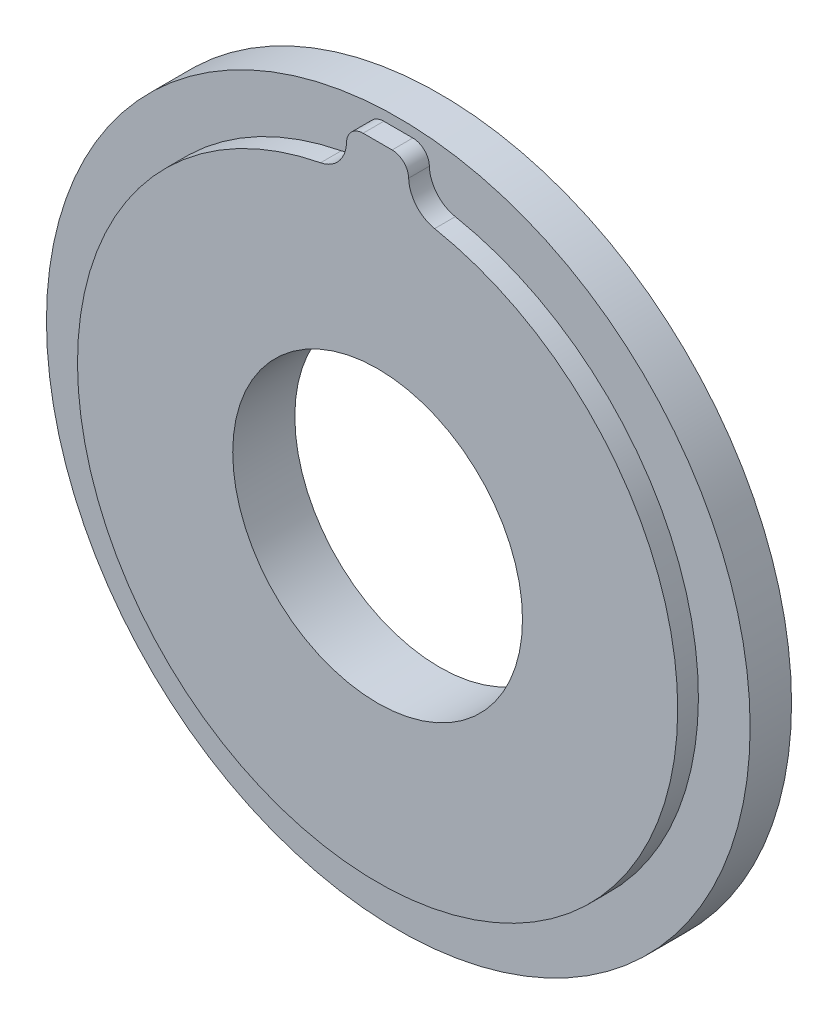
ISO-10303-21;
HEADER;
FILE_DESCRIPTION(('STEP AP214'),'2;1');
FILE_NAME('part.step','',(''),(''),'','','');
FILE_SCHEMA(('AUTOMOTIVE_DESIGN { 1 0 10303 214 1 1 1 1 }'));
ENDSEC;
DATA;
#1=APPLICATION_CONTEXT('core data for automotive mechanical design processes');
#2=APPLICATION_PROTOCOL_DEFINITION('international standard','automotive_design',2000,#1);
#3=PRODUCT_CONTEXT('',#1,'mechanical');
#4=PRODUCT('Part','Part','',(#3));
#5=PRODUCT_RELATED_PRODUCT_CATEGORY('part','',(#4));
#6=PRODUCT_DEFINITION_FORMATION('','',#4);
#7=PRODUCT_DEFINITION_CONTEXT('part definition',#1,'design');
#8=PRODUCT_DEFINITION('design','',#6,#7);
#9=PRODUCT_DEFINITION_SHAPE('','',#8);
#10=(LENGTH_UNIT() NAMED_UNIT(*) SI_UNIT(.MILLI.,.METRE.));
#11=(NAMED_UNIT(*) PLANE_ANGLE_UNIT() SI_UNIT($,.RADIAN.));
#12=(NAMED_UNIT(*) SI_UNIT($,.STERADIAN.) SOLID_ANGLE_UNIT());
#13=UNCERTAINTY_MEASURE_WITH_UNIT(LENGTH_MEASURE(1.E-05),#10,'distance_accuracy_value','');
#14=(GEOMETRIC_REPRESENTATION_CONTEXT(3) GLOBAL_UNCERTAINTY_ASSIGNED_CONTEXT((#13)) GLOBAL_UNIT_ASSIGNED_CONTEXT((#10,
#11,#12)) REPRESENTATION_CONTEXT('',''));
#15=CARTESIAN_POINT('',(0.,0.,0.));
#16=DIRECTION('',(0.,0.,1.));
#17=DIRECTION('',(1.,0.,0.));
#18=AXIS2_PLACEMENT_3D('',#15,#16,#17);
#19=CARTESIAN_POINT('',(0.,0.,2.));
#20=DIRECTION('',(0.,0.,-1.));
#21=DIRECTION('',(-1.,0.,0.));
#22=AXIS2_PLACEMENT_3D('',#19,#20,#21);
#23=CYLINDRICAL_SURFACE('',#22,17.);
#24=CARTESIAN_POINT('',(0.,0.,2.));
#25=DIRECTION('',(0.,0.,1.));
#26=DIRECTION('',(1.,0.,0.));
#27=AXIS2_PLACEMENT_3D('',#24,#25,#26);
#28=CIRCLE('',#27,17.);
#29=CARTESIAN_POINT('',(17.,0.,2.));
#30=VERTEX_POINT('',#29);
#31=EDGE_CURVE('E135',#30,#30,#28,.T.);
#32=ORIENTED_EDGE('',*,*,#31,.F.);
#33=EDGE_LOOP('',(#32));
#34=FACE_BOUND('',#33,.T.);
#35=CARTESIAN_POINT('',(0.,0.,0.));
#36=DIRECTION('',(0.,0.,1.));
#37=DIRECTION('',(1.,0.,0.));
#38=AXIS2_PLACEMENT_3D('',#35,#36,#37);
#39=CIRCLE('',#38,17.);
#40=CARTESIAN_POINT('',(17.,0.,0.));
#41=VERTEX_POINT('',#40);
#42=EDGE_CURVE('E139',#41,#41,#39,.T.);
#43=ORIENTED_EDGE('',*,*,#42,.T.);
#44=EDGE_LOOP('',(#43));
#45=FACE_BOUND('',#44,.T.);
#46=ADVANCED_FACE('F41',(#34,#45),#23,.T.);
#47=CARTESIAN_POINT('',(0.,0.,2.));
#48=DIRECTION('',(0.,0.,1.));
#49=DIRECTION('',(1.,0.,0.));
#50=AXIS2_PLACEMENT_3D('',#47,#48,#49);
#51=PLANE('',#50);
#52=CARTESIAN_POINT('',(0.,0.,2.));
#53=DIRECTION('',(0.,0.,1.));
#54=DIRECTION('',(1.,0.,0.));
#55=AXIS2_PLACEMENT_3D('',#52,#53,#54);
#56=CIRCLE('',#55,14.5);
#57=CARTESIAN_POINT('',(-2.75545171339564,14.2357818842221,2.));
#58=VERTEX_POINT('',#57);
#59=CARTESIAN_POINT('',(2.75545171339564,14.2357818842221,2.));
#60=VERTEX_POINT('',#59);
#61=EDGE_CURVE('E110',#58,#60,#56,.T.);
#62=ORIENTED_EDGE('',*,*,#61,.F.);
#63=CARTESIAN_POINT('',(-3.05,15.7575378787424,2.));
#64=DIRECTION('',(0.,0.,1.));
#65=DIRECTION('',(1.,0.,0.));
#66=AXIS2_PLACEMENT_3D('',#63,#64,#65);
#67=CIRCLE('',#66,1.55);
#68=CARTESIAN_POINT('',(-1.50046466372881,15.7195873629761,2.));
#69=VERTEX_POINT('',#68);
#70=EDGE_CURVE('E95',#58,#69,#67,.T.);
#71=ORIENTED_EDGE('',*,*,#70,.T.);
#72=CARTESIAN_POINT('',(-0.700704490169483,15.7,2.));
#73=DIRECTION('',(0.,0.,1.));
#74=DIRECTION('',(1.,0.,0.));
#75=AXIS2_PLACEMENT_3D('',#72,#73,#74);
#76=CIRCLE('',#75,0.8);
#77=CARTESIAN_POINT('',(-0.700704490169483,16.5,2.));
#78=VERTEX_POINT('',#77);
#79=EDGE_CURVE('E11',#69,#78,#76,.F.);
#80=ORIENTED_EDGE('',*,*,#79,.T.);
#81=DIRECTION('',(1.,0.,0.));
#82=VECTOR('',#81,1.);
#83=CARTESIAN_POINT('',(0.,16.5,2.));
#84=LINE('',#83,#82);
#85=CARTESIAN_POINT('',(0.700704490169483,16.5,2.));
#86=VERTEX_POINT('',#85);
#87=EDGE_CURVE('E121',#78,#86,#84,.T.);
#88=ORIENTED_EDGE('',*,*,#87,.T.);
#89=CARTESIAN_POINT('',(0.700704490169483,15.7,2.));
#90=DIRECTION('',(0.,0.,1.));
#91=DIRECTION('',(1.,0.,0.));
#92=AXIS2_PLACEMENT_3D('',#89,#90,#91);
#93=CIRCLE('',#92,0.8);
#94=CARTESIAN_POINT('',(1.50046466372881,15.7195873629761,2.));
#95=VERTEX_POINT('',#94);
#96=EDGE_CURVE('E50',#86,#95,#93,.F.);
#97=ORIENTED_EDGE('',*,*,#96,.T.);
#98=CARTESIAN_POINT('',(3.05,15.7575378787424,2.));
#99=DIRECTION('',(0.,0.,1.));
#100=DIRECTION('',(1.,0.,0.));
#101=AXIS2_PLACEMENT_3D('',#98,#99,#100);
#102=CIRCLE('',#101,1.55);
#103=EDGE_CURVE('E104',#95,#60,#102,.T.);
#104=ORIENTED_EDGE('',*,*,#103,.T.);
#105=EDGE_LOOP('',(#62,#71,#80,#88,#97,#104));
#106=FACE_BOUND('',#105,.T.);
#107=ORIENTED_EDGE('',*,*,#31,.T.);
#108=EDGE_LOOP('',(#107));
#109=FACE_BOUND('',#108,.T.);
#110=ADVANCED_FACE('F117',(#106,#109),#51,.T.);
#111=CARTESIAN_POINT('',(0.,0.,0.));
#112=DIRECTION('',(0.,0.,1.));
#113=DIRECTION('',(1.,0.,0.));
#114=AXIS2_PLACEMENT_3D('',#111,#112,#113);
#115=PLANE('',#114);
#116=CARTESIAN_POINT('',(0.,0.,0.));
#117=DIRECTION('',(0.,0.,1.));
#118=DIRECTION('',(1.,0.,0.));
#119=AXIS2_PLACEMENT_3D('',#116,#117,#118);
#120=CIRCLE('',#119,7.);
#121=CARTESIAN_POINT('',(7.,0.,0.));
#122=VERTEX_POINT('',#121);
#123=EDGE_CURVE('E122',#122,#122,#120,.T.);
#124=ORIENTED_EDGE('',*,*,#123,.T.);
#125=EDGE_LOOP('',(#124));
#126=FACE_BOUND('',#125,.T.);
#127=ORIENTED_EDGE('',*,*,#42,.F.);
#128=EDGE_LOOP('',(#127));
#129=FACE_BOUND('',#128,.T.);
#130=ADVANCED_FACE('F207',(#126,#129),#115,.F.);
#131=CARTESIAN_POINT('',(0.,0.,3.));
#132=DIRECTION('',(0.,0.,-1.));
#133=DIRECTION('',(-1.,0.,0.));
#134=AXIS2_PLACEMENT_3D('',#131,#132,#133);
#135=CYLINDRICAL_SURFACE('',#134,14.5);
#136=CARTESIAN_POINT('',(0.,0.,3.));
#137=DIRECTION('',(0.,0.,1.));
#138=DIRECTION('',(1.,0.,0.));
#139=AXIS2_PLACEMENT_3D('',#136,#137,#138);
#140=CIRCLE('',#139,14.5);
#141=CARTESIAN_POINT('',(-2.75545171339564,14.2357818842221,3.));
#142=VERTEX_POINT('',#141);
#143=CARTESIAN_POINT('',(2.75545171339564,14.2357818842221,3.));
#144=VERTEX_POINT('',#143);
#145=EDGE_CURVE('E113',#142,#144,#140,.T.);
#146=ORIENTED_EDGE('',*,*,#145,.F.);
#147=DIRECTION('',(0.,0.,-1.));
#148=VECTOR('',#147,1.);
#149=CARTESIAN_POINT('',(-2.75545171339564,14.2357818842221,3.));
#150=LINE('',#149,#148);
#151=EDGE_CURVE('E98',#142,#58,#150,.T.);
#152=ORIENTED_EDGE('',*,*,#151,.T.);
#153=ORIENTED_EDGE('',*,*,#61,.T.);
#154=DIRECTION('',(0.,0.,-1.));
#155=VECTOR('',#154,1.);
#156=CARTESIAN_POINT('',(2.75545171339564,14.2357818842221,3.));
#157=LINE('',#156,#155);
#158=EDGE_CURVE('E115',#60,#144,#157,.F.);
#159=ORIENTED_EDGE('',*,*,#158,.T.);
#160=EDGE_LOOP('',(#146,#152,#153,#159));
#161=FACE_BOUND('',#160,.T.);
#162=ADVANCED_FACE('F109',(#161),#135,.T.);
#163=CARTESIAN_POINT('',(0.,16.5,3.));
#164=DIRECTION('',(0.,1.,0.));
#165=DIRECTION('',(0.,0.,1.));
#166=AXIS2_PLACEMENT_3D('',#163,#164,#165);
#167=PLANE('',#166);
#168=DIRECTION('',(1.,0.,0.));
#169=VECTOR('',#168,1.);
#170=CARTESIAN_POINT('',(0.,16.5,3.));
#171=LINE('',#170,#169);
#172=CARTESIAN_POINT('',(-0.700704490169483,16.5,3.));
#173=VERTEX_POINT('',#172);
#174=CARTESIAN_POINT('',(0.700704490169483,16.5,3.));
#175=VERTEX_POINT('',#174);
#176=EDGE_CURVE('E132',#173,#175,#171,.T.);
#177=ORIENTED_EDGE('',*,*,#176,.T.);
#178=DIRECTION('',(0.,0.,1.));
#179=VECTOR('',#178,1.);
#180=CARTESIAN_POINT('',(0.700704490169483,16.5,2.));
#181=LINE('',#180,#179);
#182=EDGE_CURVE('E156',#175,#86,#181,.F.);
#183=ORIENTED_EDGE('',*,*,#182,.T.);
#184=ORIENTED_EDGE('',*,*,#87,.F.);
#185=DIRECTION('',(0.,0.,1.));
#186=VECTOR('',#185,1.);
#187=CARTESIAN_POINT('',(-0.700704490169483,16.5,3.));
#188=LINE('',#187,#186);
#189=EDGE_CURVE('E153',#78,#173,#188,.T.);
#190=ORIENTED_EDGE('',*,*,#189,.T.);
#191=EDGE_LOOP('',(#177,#183,#184,#190));
#192=FACE_BOUND('',#191,.T.);
#193=ADVANCED_FACE('F182',(#192),#167,.T.);
#194=CARTESIAN_POINT('',(0.,0.,3.));
#195=DIRECTION('',(0.,0.,1.));
#196=DIRECTION('',(1.,0.,0.));
#197=AXIS2_PLACEMENT_3D('',#194,#195,#196);
#198=PLANE('',#197);
#199=CARTESIAN_POINT('',(0.,0.,3.));
#200=DIRECTION('',(0.,0.,1.));
#201=DIRECTION('',(1.,0.,0.));
#202=AXIS2_PLACEMENT_3D('',#199,#200,#201);
#203=CIRCLE('',#202,7.);
#204=CARTESIAN_POINT('',(7.,0.,3.));
#205=VERTEX_POINT('',#204);
#206=EDGE_CURVE('E129',#205,#205,#203,.T.);
#207=ORIENTED_EDGE('',*,*,#206,.F.);
#208=EDGE_LOOP('',(#207));
#209=FACE_BOUND('',#208,.T.);
#210=CARTESIAN_POINT('',(3.05,15.7575378787424,3.));
#211=DIRECTION('',(0.,0.,1.));
#212=DIRECTION('',(1.,0.,0.));
#213=AXIS2_PLACEMENT_3D('',#210,#211,#212);
#214=CIRCLE('',#213,1.55);
#215=CARTESIAN_POINT('',(1.50046466372881,15.7195873629761,3.));
#216=VERTEX_POINT('',#215);
#217=EDGE_CURVE('E149',#144,#216,#214,.F.);
#218=ORIENTED_EDGE('',*,*,#217,.T.);
#219=CARTESIAN_POINT('',(0.700704490169483,15.7,3.));
#220=DIRECTION('',(0.,0.,1.));
#221=DIRECTION('',(1.,0.,0.));
#222=AXIS2_PLACEMENT_3D('',#219,#220,#221);
#223=CIRCLE('',#222,0.8);
#224=EDGE_CURVE('E165',#216,#175,#223,.T.);
#225=ORIENTED_EDGE('',*,*,#224,.T.);
#226=ORIENTED_EDGE('',*,*,#176,.F.);
#227=CARTESIAN_POINT('',(-0.700704490169483,15.7,3.));
#228=DIRECTION('',(0.,0.,1.));
#229=DIRECTION('',(1.,0.,0.));
#230=AXIS2_PLACEMENT_3D('',#227,#228,#229);
#231=CIRCLE('',#230,0.8);
#232=CARTESIAN_POINT('',(-1.50046466372881,15.7195873629761,3.));
#233=VERTEX_POINT('',#232);
#234=EDGE_CURVE('E63',#173,#233,#231,.T.);
#235=ORIENTED_EDGE('',*,*,#234,.T.);
#236=CARTESIAN_POINT('',(-3.05,15.7575378787424,3.));
#237=DIRECTION('',(0.,0.,1.));
#238=DIRECTION('',(1.,0.,0.));
#239=AXIS2_PLACEMENT_3D('',#236,#237,#238);
#240=CIRCLE('',#239,1.55);
#241=EDGE_CURVE('E103',#233,#142,#240,.F.);
#242=ORIENTED_EDGE('',*,*,#241,.T.);
#243=ORIENTED_EDGE('',*,*,#145,.T.);
#244=EDGE_LOOP('',(#218,#225,#226,#235,#242,#243));
#245=FACE_BOUND('',#244,.T.);
#246=ADVANCED_FACE('F180',(#209,#245),#198,.T.);
#247=CARTESIAN_POINT('',(-3.05,15.7575378787424,3.));
#248=DIRECTION('',(0.,0.,-1.));
#249=DIRECTION('',(-1.,0.,0.));
#250=AXIS2_PLACEMENT_3D('',#247,#248,#249);
#251=CYLINDRICAL_SURFACE('',#250,1.55);
#252=ORIENTED_EDGE('',*,*,#241,.F.);
#253=DIRECTION('',(0.,0.,-1.));
#254=VECTOR('',#253,1.);
#255=CARTESIAN_POINT('',(-1.50046466372881,15.7195873629761,3.));
#256=LINE('',#255,#254);
#257=EDGE_CURVE('E99',#233,#69,#256,.T.);
#258=ORIENTED_EDGE('',*,*,#257,.T.);
#259=ORIENTED_EDGE('',*,*,#70,.F.);
#260=ORIENTED_EDGE('',*,*,#151,.F.);
#261=EDGE_LOOP('',(#252,#258,#259,#260));
#262=FACE_BOUND('',#261,.T.);
#263=ADVANCED_FACE('F97',(#262),#251,.F.);
#264=CARTESIAN_POINT('',(3.05,15.7575378787424,3.));
#265=DIRECTION('',(0.,0.,-1.));
#266=DIRECTION('',(-1.,0.,0.));
#267=AXIS2_PLACEMENT_3D('',#264,#265,#266);
#268=CYLINDRICAL_SURFACE('',#267,1.55);
#269=ORIENTED_EDGE('',*,*,#103,.F.);
#270=DIRECTION('',(0.,0.,-1.));
#271=VECTOR('',#270,1.);
#272=CARTESIAN_POINT('',(1.50046466372881,15.7195873629761,3.));
#273=LINE('',#272,#271);
#274=EDGE_CURVE('E160',#95,#216,#273,.F.);
#275=ORIENTED_EDGE('',*,*,#274,.T.);
#276=ORIENTED_EDGE('',*,*,#217,.F.);
#277=ORIENTED_EDGE('',*,*,#158,.F.);
#278=EDGE_LOOP('',(#269,#275,#276,#277));
#279=FACE_BOUND('',#278,.T.);
#280=ADVANCED_FACE('F175',(#279),#268,.F.);
#281=CARTESIAN_POINT('',(0.700704490169483,15.7,3.));
#282=DIRECTION('',(0.,0.,-1.));
#283=DIRECTION('',(-1.,0.,0.));
#284=AXIS2_PLACEMENT_3D('',#281,#282,#283);
#285=CYLINDRICAL_SURFACE('',#284,0.8);
#286=ORIENTED_EDGE('',*,*,#224,.F.);
#287=ORIENTED_EDGE('',*,*,#274,.F.);
#288=ORIENTED_EDGE('',*,*,#96,.F.);
#289=ORIENTED_EDGE('',*,*,#182,.F.);
#290=EDGE_LOOP('',(#286,#287,#288,#289));
#291=FACE_BOUND('',#290,.T.);
#292=ADVANCED_FACE('F178',(#291),#285,.T.);
#293=CARTESIAN_POINT('',(-0.700704490169483,15.7,3.));
#294=DIRECTION('',(0.,0.,-1.));
#295=DIRECTION('',(-1.,0.,0.));
#296=AXIS2_PLACEMENT_3D('',#293,#294,#295);
#297=CYLINDRICAL_SURFACE('',#296,0.8);
#298=ORIENTED_EDGE('',*,*,#234,.F.);
#299=ORIENTED_EDGE('',*,*,#189,.F.);
#300=ORIENTED_EDGE('',*,*,#79,.F.);
#301=ORIENTED_EDGE('',*,*,#257,.F.);
#302=EDGE_LOOP('',(#298,#299,#300,#301));
#303=FACE_BOUND('',#302,.T.);
#304=ADVANCED_FACE('F43',(#303),#297,.T.);
#305=CARTESIAN_POINT('',(0.,0.,0.));
#306=DIRECTION('',(0.,0.,1.));
#307=DIRECTION('',(1.,0.,0.));
#308=AXIS2_PLACEMENT_3D('',#305,#306,#307);
#309=CYLINDRICAL_SURFACE('',#308,7.);
#310=ORIENTED_EDGE('',*,*,#123,.F.);
#311=EDGE_LOOP('',(#310));
#312=FACE_BOUND('',#311,.T.);
#313=ORIENTED_EDGE('',*,*,#206,.T.);
#314=EDGE_LOOP('',(#313));
#315=FACE_BOUND('',#314,.T.);
#316=ADVANCED_FACE('F190',(#312,#315),#309,.F.);
#317=CLOSED_SHELL('',(#46,#110,#130,#162,#193,#246,#263,#280,#292,#304,#316));
#318=MANIFOLD_SOLID_BREP('B2',#317);
#319=ADVANCED_BREP_SHAPE_REPRESENTATION('',(#18,#318),#14);
#320=SHAPE_DEFINITION_REPRESENTATION(#9,#319);
ENDSEC;
END-ISO-10303-21;
